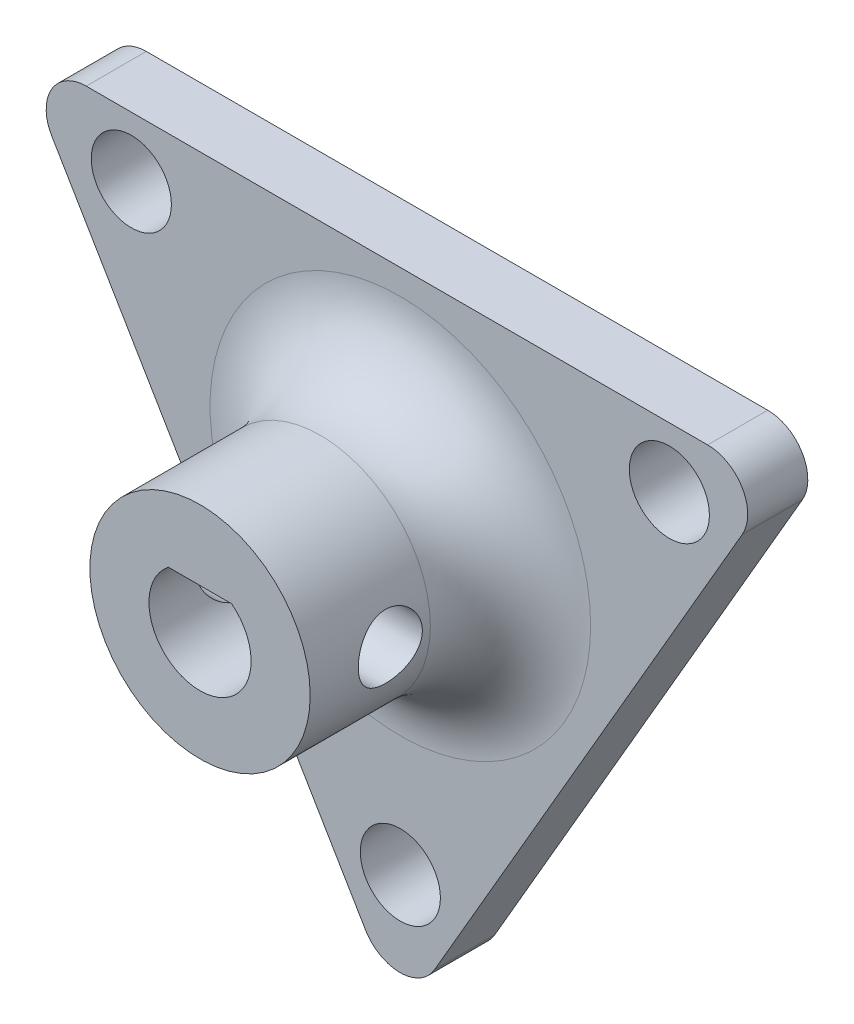
ISO-10303-21;
HEADER;
FILE_DESCRIPTION(('STEP AP214'),'2;1');
FILE_NAME('part.step','',(''),(''),'','','');
FILE_SCHEMA(('AUTOMOTIVE_DESIGN { 1 0 10303 214 1 1 1 1 }'));
ENDSEC;
DATA;
#1=APPLICATION_CONTEXT('core data for automotive mechanical design processes');
#2=APPLICATION_PROTOCOL_DEFINITION('international standard','automotive_design',2000,#1);
#3=PRODUCT_CONTEXT('',#1,'mechanical');
#4=PRODUCT('Part','Part','',(#3));
#5=PRODUCT_RELATED_PRODUCT_CATEGORY('part','',(#4));
#6=PRODUCT_DEFINITION_FORMATION('','',#4);
#7=PRODUCT_DEFINITION_CONTEXT('part definition',#1,'design');
#8=PRODUCT_DEFINITION('design','',#6,#7);
#9=PRODUCT_DEFINITION_SHAPE('','',#8);
#10=(LENGTH_UNIT() NAMED_UNIT(*) SI_UNIT(.MILLI.,.METRE.));
#11=(NAMED_UNIT(*) PLANE_ANGLE_UNIT() SI_UNIT($,.RADIAN.));
#12=(NAMED_UNIT(*) SI_UNIT($,.STERADIAN.) SOLID_ANGLE_UNIT());
#13=UNCERTAINTY_MEASURE_WITH_UNIT(LENGTH_MEASURE(1.E-05),#10,'distance_accuracy_value','');
#14=(GEOMETRIC_REPRESENTATION_CONTEXT(3) GLOBAL_UNCERTAINTY_ASSIGNED_CONTEXT((#13)) GLOBAL_UNIT_ASSIGNED_CONTEXT((#10,
#11,#12)) REPRESENTATION_CONTEXT('',''));
#15=CARTESIAN_POINT('',(0.,0.,0.));
#16=DIRECTION('',(0.,0.,1.));
#17=DIRECTION('',(1.,0.,0.));
#18=AXIS2_PLACEMENT_3D('',#15,#16,#17);
#19=CARTESIAN_POINT('',(0.,0.,3.));
#20=DIRECTION('',(0.,0.,1.));
#21=DIRECTION('',(1.,0.,0.));
#22=AXIS2_PLACEMENT_3D('',#19,#20,#21);
#23=PLANE('',#22);
#24=CARTESIAN_POINT('',(0.,3.88055185792684,3.));
#25=DIRECTION('',(0.,0.,1.));
#26=DIRECTION('',(1.,0.,0.));
#27=AXIS2_PLACEMENT_3D('',#24,#25,#26);
#28=CIRCLE('',#27,9.5);
#29=CARTESIAN_POINT('',(9.5,3.88055185792684,3.));
#30=VERTEX_POINT('',#29);
#31=EDGE_CURVE('E11',#30,#30,#28,.F.);
#32=ORIENTED_EDGE('',*,*,#31,.T.);
#33=EDGE_LOOP('',(#32));
#34=FACE_BOUND('',#33,.T.);
#35=CARTESIAN_POINT('',(13.4298049166789,11.6305518579268,3.));
#36=DIRECTION('',(0.,0.,1.));
#37=DIRECTION('',(1.,0.,0.));
#38=AXIS2_PLACEMENT_3D('',#35,#36,#37);
#39=CIRCLE('',#38,1.99999986367292);
#40=CARTESIAN_POINT('',(15.4298047803518,11.6305518579268,3.));
#41=VERTEX_POINT('',#40);
#42=EDGE_CURVE('E169',#41,#41,#39,.T.);
#43=ORIENTED_EDGE('',*,*,#42,.F.);
#44=EDGE_LOOP('',(#43));
#45=FACE_BOUND('',#44,.T.);
#46=DIRECTION('',(0.508933447570748,-0.860805870068132,0.));
#47=VECTOR('',#46,1.);
#48=CARTESIAN_POINT('',(1.2959652374831E-07,-17.8210655158097,3.));
#49=LINE('',#48,#47);
#50=CARTESIAN_POINT('',(-17.4020885722648,11.6126849627853,3.));
#51=VERTEX_POINT('',#50);
#52=CARTESIAN_POINT('',(-1.73853871700117,-14.8805151321866,3.));
#53=VERTEX_POINT('',#52);
#54=EDGE_CURVE('E185',#51,#53,#49,.T.);
#55=ORIENTED_EDGE('',*,*,#54,.T.);
#56=CARTESIAN_POINT('',(-0.0169269768649123,-13.8626482370451,3.));
#57=DIRECTION('',(0.,0.,1.));
#58=DIRECTION('',(1.,0.,0.));
#59=AXIS2_PLACEMENT_3D('',#56,#57,#58);
#60=CIRCLE('',#59,2.);
#61=CARTESIAN_POINT('',(1.71332690976511,-14.8657541575748,3.));
#62=VERTEX_POINT('',#61);
#63=EDGE_CURVE('E238',#53,#62,#60,.T.);
#64=ORIENTED_EDGE('',*,*,#63,.T.);
#65=DIRECTION('',(0.501552960264837,0.865126943315013,0.));
#66=VECTOR('',#65,1.);
#67=CARTESIAN_POINT('',(18.8136608125153,14.6305518579268,3.));
#68=LINE('',#67,#66);
#69=CARTESIAN_POINT('',(17.0726253771155,11.6274459373972,3.));
#70=VERTEX_POINT('',#69);
#71=EDGE_CURVE('E189',#62,#70,#68,.T.);
#72=ORIENTED_EDGE('',*,*,#71,.T.);
#73=CARTESIAN_POINT('',(15.3423714904855,12.6305518579268,3.));
#74=DIRECTION('',(0.,0.,1.));
#75=DIRECTION('',(1.,0.,0.));
#76=AXIS2_PLACEMENT_3D('',#73,#74,#75);
#77=CIRCLE('',#76,2.);
#78=CARTESIAN_POINT('',(15.3423714904855,14.6305518579268,3.));
#79=VERTEX_POINT('',#78);
#80=EDGE_CURVE('E75',#70,#79,#77,.T.);
#81=ORIENTED_EDGE('',*,*,#80,.T.);
#82=DIRECTION('',(-1.,0.,0.));
#83=VECTOR('',#82,1.);
#84=CARTESIAN_POINT('',(-19.1863391874847,14.6305518579268,3.));
#85=LINE('',#84,#83);
#86=CARTESIAN_POINT('',(-15.6804768321285,14.6305518579268,3.));
#87=VERTEX_POINT('',#86);
#88=EDGE_CURVE('E193',#79,#87,#85,.T.);
#89=ORIENTED_EDGE('',*,*,#88,.T.);
#90=CARTESIAN_POINT('',(-15.6804768321285,12.6305518579268,3.));
#91=DIRECTION('',(0.,0.,1.));
#92=DIRECTION('',(1.,0.,0.));
#93=AXIS2_PLACEMENT_3D('',#90,#91,#92);
#94=CIRCLE('',#93,2.);
#95=EDGE_CURVE('E233',#87,#51,#94,.T.);
#96=ORIENTED_EDGE('',*,*,#95,.T.);
#97=EDGE_LOOP('',(#55,#64,#72,#81,#89,#96));
#98=FACE_BOUND('',#97,.T.);
#99=CARTESIAN_POINT('',(-13.4298050858359,11.6305518579268,3.));
#100=DIRECTION('',(0.,0.,1.));
#101=DIRECTION('',(1.,0.,0.));
#102=AXIS2_PLACEMENT_3D('',#99,#100,#101);
#103=CIRCLE('',#102,2.00000003801693);
#104=CARTESIAN_POINT('',(-11.429805047819,11.6305518579268,3.));
#105=VERTEX_POINT('',#104);
#106=EDGE_CURVE('E177',#105,#105,#103,.T.);
#107=ORIENTED_EDGE('',*,*,#106,.F.);
#108=EDGE_LOOP('',(#107));
#109=FACE_BOUND('',#108,.T.);
#110=CARTESIAN_POINT('',(8.45785073921856E-08,-11.6305518579268,3.));
#111=DIRECTION('',(0.,0.,1.));
#112=DIRECTION('',(1.,0.,0.));
#113=AXIS2_PLACEMENT_3D('',#110,#111,#112);
#114=CIRCLE('',#113,1.99999985492947);
#115=CARTESIAN_POINT('',(1.99999993950797,-11.6305518579268,3.));
#116=VERTEX_POINT('',#115);
#117=EDGE_CURVE('E161',#116,#116,#114,.T.);
#118=ORIENTED_EDGE('',*,*,#117,.F.);
#119=EDGE_LOOP('',(#118));
#120=FACE_BOUND('',#119,.T.);
#121=ADVANCED_FACE('F45',(#34,#45,#98,#109,#120),#23,.T.);
#122=CARTESIAN_POINT('',(0.,0.,0.));
#123=DIRECTION('',(0.,0.,1.));
#124=DIRECTION('',(1.,0.,0.));
#125=AXIS2_PLACEMENT_3D('',#122,#123,#124);
#126=PLANE('',#125);
#127=DIRECTION('',(-1.,0.,0.));
#128=VECTOR('',#127,1.);
#129=CARTESIAN_POINT('',(-1.58192920195564,5.88055185792684,0.));
#130=LINE('',#129,#128);
#131=CARTESIAN_POINT('',(1.58192920195564,5.88055185792684,0.));
#132=VERTEX_POINT('',#131);
#133=CARTESIAN_POINT('',(-1.58192920195564,5.88055185792684,0.));
#134=VERTEX_POINT('',#133);
#135=EDGE_CURVE('E132',#132,#134,#130,.T.);
#136=ORIENTED_EDGE('',*,*,#135,.T.);
#137=CARTESIAN_POINT('',(0.,3.88055185792684,0.));
#138=DIRECTION('',(0.,0.,1.));
#139=DIRECTION('',(1.,0.,0.));
#140=AXIS2_PLACEMENT_3D('',#137,#138,#139);
#141=CIRCLE('',#140,2.55);
#142=EDGE_CURVE('E124',#134,#132,#141,.T.);
#143=ORIENTED_EDGE('',*,*,#142,.T.);
#144=EDGE_LOOP('',(#136,#143));
#145=FACE_BOUND('',#144,.T.);
#146=DIRECTION('',(0.501552960264837,0.865126943315013,0.));
#147=VECTOR('',#146,1.);
#148=CARTESIAN_POINT('',(18.8136608125153,14.6305518579268,0.));
#149=LINE('',#148,#147);
#150=CARTESIAN_POINT('',(1.71332690976511,-14.8657541575748,0.));
#151=VERTEX_POINT('',#150);
#152=CARTESIAN_POINT('',(17.0726253771155,11.6274459373972,0.));
#153=VERTEX_POINT('',#152);
#154=EDGE_CURVE('E200',#151,#153,#149,.T.);
#155=ORIENTED_EDGE('',*,*,#154,.F.);
#156=CARTESIAN_POINT('',(-0.0169269768649123,-13.8626482370451,0.));
#157=DIRECTION('',(0.,0.,1.));
#158=DIRECTION('',(1.,0.,0.));
#159=AXIS2_PLACEMENT_3D('',#156,#157,#158);
#160=CIRCLE('',#159,2.);
#161=CARTESIAN_POINT('',(-1.73853871700117,-14.8805151321866,0.));
#162=VERTEX_POINT('',#161);
#163=EDGE_CURVE('E223',#151,#162,#160,.F.);
#164=ORIENTED_EDGE('',*,*,#163,.T.);
#165=DIRECTION('',(0.508933447570748,-0.860805870068132,0.));
#166=VECTOR('',#165,1.);
#167=CARTESIAN_POINT('',(1.2959652374831E-07,-17.8210655158097,0.));
#168=LINE('',#167,#166);
#169=CARTESIAN_POINT('',(-17.4020885722648,11.6126849627853,0.));
#170=VERTEX_POINT('',#169);
#171=EDGE_CURVE('E181',#170,#162,#168,.T.);
#172=ORIENTED_EDGE('',*,*,#171,.F.);
#173=CARTESIAN_POINT('',(-15.6804768321285,12.6305518579268,0.));
#174=DIRECTION('',(0.,0.,1.));
#175=DIRECTION('',(1.,0.,0.));
#176=AXIS2_PLACEMENT_3D('',#173,#174,#175);
#177=CIRCLE('',#176,2.);
#178=CARTESIAN_POINT('',(-15.6804768321285,14.6305518579268,0.));
#179=VERTEX_POINT('',#178);
#180=EDGE_CURVE('E217',#170,#179,#177,.F.);
#181=ORIENTED_EDGE('',*,*,#180,.T.);
#182=DIRECTION('',(-1.,0.,0.));
#183=VECTOR('',#182,1.);
#184=CARTESIAN_POINT('',(-19.1863391874847,14.6305518579268,0.));
#185=LINE('',#184,#183);
#186=CARTESIAN_POINT('',(15.3423714904855,14.6305518579268,0.));
#187=VERTEX_POINT('',#186);
#188=EDGE_CURVE('E190',#187,#179,#185,.T.);
#189=ORIENTED_EDGE('',*,*,#188,.F.);
#190=CARTESIAN_POINT('',(15.3423714904855,12.6305518579268,0.));
#191=DIRECTION('',(0.,0.,1.));
#192=DIRECTION('',(1.,0.,0.));
#193=AXIS2_PLACEMENT_3D('',#190,#191,#192);
#194=CIRCLE('',#193,2.);
#195=EDGE_CURVE('E220',#187,#153,#194,.F.);
#196=ORIENTED_EDGE('',*,*,#195,.T.);
#197=EDGE_LOOP('',(#155,#164,#172,#181,#189,#196));
#198=FACE_BOUND('',#197,.T.);
#199=CARTESIAN_POINT('',(-13.4298050858359,11.6305518579268,0.));
#200=DIRECTION('',(0.,0.,1.));
#201=DIRECTION('',(1.,0.,0.));
#202=AXIS2_PLACEMENT_3D('',#199,#200,#201);
#203=CIRCLE('',#202,2.00000003801693);
#204=CARTESIAN_POINT('',(-11.429805047819,11.6305518579268,0.));
#205=VERTEX_POINT('',#204);
#206=EDGE_CURVE('E173',#205,#205,#203,.T.);
#207=ORIENTED_EDGE('',*,*,#206,.T.);
#208=EDGE_LOOP('',(#207));
#209=FACE_BOUND('',#208,.T.);
#210=CARTESIAN_POINT('',(13.4298049166789,11.6305518579268,0.));
#211=DIRECTION('',(0.,0.,1.));
#212=DIRECTION('',(1.,0.,0.));
#213=AXIS2_PLACEMENT_3D('',#210,#211,#212);
#214=CIRCLE('',#213,1.99999986367292);
#215=CARTESIAN_POINT('',(15.4298047803518,11.6305518579268,0.));
#216=VERTEX_POINT('',#215);
#217=EDGE_CURVE('E165',#216,#216,#214,.T.);
#218=ORIENTED_EDGE('',*,*,#217,.T.);
#219=EDGE_LOOP('',(#218));
#220=FACE_BOUND('',#219,.T.);
#221=CARTESIAN_POINT('',(8.45785073921856E-08,-11.6305518579268,0.));
#222=DIRECTION('',(0.,0.,1.));
#223=DIRECTION('',(1.,0.,0.));
#224=AXIS2_PLACEMENT_3D('',#221,#222,#223);
#225=CIRCLE('',#224,1.99999985492947);
#226=CARTESIAN_POINT('',(1.99999993950797,-11.6305518579268,0.));
#227=VERTEX_POINT('',#226);
#228=EDGE_CURVE('E160',#227,#227,#225,.T.);
#229=ORIENTED_EDGE('',*,*,#228,.T.);
#230=EDGE_LOOP('',(#229));
#231=FACE_BOUND('',#230,.T.);
#232=ADVANCED_FACE('F139',(#145,#198,#209,#220,#231),#126,.F.);
#233=CARTESIAN_POINT('',(1.2959652374831E-07,-17.8210655158097,3.));
#234=DIRECTION('',(0.860805870068132,0.508933447570747,0.));
#235=DIRECTION('',(-0.508933447570748,0.860805870068132,0.));
#236=AXIS2_PLACEMENT_3D('',#233,#234,#235);
#237=PLANE('',#236);
#238=ORIENTED_EDGE('',*,*,#171,.T.);
#239=DIRECTION('',(0.,0.,-1.));
#240=VECTOR('',#239,1.);
#241=CARTESIAN_POINT('',(-1.73853871700117,-14.8805151321866,3.));
#242=LINE('',#241,#240);
#243=EDGE_CURVE('E230',#162,#53,#242,.F.);
#244=ORIENTED_EDGE('',*,*,#243,.T.);
#245=ORIENTED_EDGE('',*,*,#54,.F.);
#246=DIRECTION('',(0.,0.,-1.));
#247=VECTOR('',#246,1.);
#248=CARTESIAN_POINT('',(-17.4020885722648,11.6126849627853,3.));
#249=LINE('',#248,#247);
#250=EDGE_CURVE('E226',#51,#170,#249,.T.);
#251=ORIENTED_EDGE('',*,*,#250,.T.);
#252=EDGE_LOOP('',(#238,#244,#245,#251));
#253=FACE_BOUND('',#252,.T.);
#254=ADVANCED_FACE('F296',(#253),#237,.F.);
#255=CARTESIAN_POINT('',(18.8136608125153,14.6305518579268,3.));
#256=DIRECTION('',(-0.865126943315013,0.501552960264837,0.));
#257=DIRECTION('',(-0.501552960264837,-0.865126943315013,0.));
#258=AXIS2_PLACEMENT_3D('',#255,#256,#257);
#259=PLANE('',#258);
#260=ORIENTED_EDGE('',*,*,#71,.F.);
#261=DIRECTION('',(0.,0.,-1.));
#262=VECTOR('',#261,1.);
#263=CARTESIAN_POINT('',(1.71332690976512,-14.8657541575748,3.));
#264=LINE('',#263,#262);
#265=EDGE_CURVE('E213',#62,#151,#264,.T.);
#266=ORIENTED_EDGE('',*,*,#265,.T.);
#267=ORIENTED_EDGE('',*,*,#154,.T.);
#268=DIRECTION('',(0.,0.,-1.));
#269=VECTOR('',#268,1.);
#270=CARTESIAN_POINT('',(17.0726253771155,11.6274459373972,3.));
#271=LINE('',#270,#269);
#272=EDGE_CURVE('E210',#153,#70,#271,.F.);
#273=ORIENTED_EDGE('',*,*,#272,.T.);
#274=EDGE_LOOP('',(#260,#266,#267,#273));
#275=FACE_BOUND('',#274,.T.);
#276=ADVANCED_FACE('F299',(#275),#259,.F.);
#277=CARTESIAN_POINT('',(-19.1863391874847,14.6305518579268,3.));
#278=DIRECTION('',(0.,-1.,0.));
#279=DIRECTION('',(0.,0.,-1.));
#280=AXIS2_PLACEMENT_3D('',#277,#278,#279);
#281=PLANE('',#280);
#282=ORIENTED_EDGE('',*,*,#88,.F.);
#283=DIRECTION('',(0.,0.,-1.));
#284=VECTOR('',#283,1.);
#285=CARTESIAN_POINT('',(15.3423714904855,14.6305518579268,3.));
#286=LINE('',#285,#284);
#287=EDGE_CURVE('E243',#79,#187,#286,.T.);
#288=ORIENTED_EDGE('',*,*,#287,.T.);
#289=ORIENTED_EDGE('',*,*,#188,.T.);
#290=DIRECTION('',(0.,0.,-1.));
#291=VECTOR('',#290,1.);
#292=CARTESIAN_POINT('',(-15.6804768321285,14.6305518579268,3.));
#293=LINE('',#292,#291);
#294=EDGE_CURVE('E68',#179,#87,#293,.F.);
#295=ORIENTED_EDGE('',*,*,#294,.T.);
#296=EDGE_LOOP('',(#282,#288,#289,#295));
#297=FACE_BOUND('',#296,.T.);
#298=ADVANCED_FACE('F289',(#297),#281,.F.);
#299=CARTESIAN_POINT('',(-13.4298050858359,11.6305518579268,3.));
#300=DIRECTION('',(0.,0.,-1.));
#301=DIRECTION('',(-1.,0.,0.));
#302=AXIS2_PLACEMENT_3D('',#299,#300,#301);
#303=CYLINDRICAL_SURFACE('',#302,2.00000003801693);
#304=ORIENTED_EDGE('',*,*,#106,.T.);
#305=EDGE_LOOP('',(#304));
#306=FACE_BOUND('',#305,.T.);
#307=ORIENTED_EDGE('',*,*,#206,.F.);
#308=EDGE_LOOP('',(#307));
#309=FACE_BOUND('',#308,.T.);
#310=ADVANCED_FACE('F285',(#306,#309),#303,.F.);
#311=CARTESIAN_POINT('',(13.4298049166789,11.6305518579268,3.));
#312=DIRECTION('',(0.,0.,-1.));
#313=DIRECTION('',(-1.,0.,0.));
#314=AXIS2_PLACEMENT_3D('',#311,#312,#313);
#315=CYLINDRICAL_SURFACE('',#314,1.99999986367292);
#316=ORIENTED_EDGE('',*,*,#42,.T.);
#317=EDGE_LOOP('',(#316));
#318=FACE_BOUND('',#317,.T.);
#319=ORIENTED_EDGE('',*,*,#217,.F.);
#320=EDGE_LOOP('',(#319));
#321=FACE_BOUND('',#320,.T.);
#322=ADVANCED_FACE('F281',(#318,#321),#315,.F.);
#323=CARTESIAN_POINT('',(8.45785073921856E-08,-11.6305518579268,3.));
#324=DIRECTION('',(0.,0.,-1.));
#325=DIRECTION('',(-1.,0.,0.));
#326=AXIS2_PLACEMENT_3D('',#323,#324,#325);
#327=CYLINDRICAL_SURFACE('',#326,1.99999985492947);
#328=ORIENTED_EDGE('',*,*,#117,.T.);
#329=EDGE_LOOP('',(#328));
#330=FACE_BOUND('',#329,.T.);
#331=ORIENTED_EDGE('',*,*,#228,.F.);
#332=EDGE_LOOP('',(#331));
#333=FACE_BOUND('',#332,.T.);
#334=ADVANCED_FACE('F276',(#330,#333),#327,.F.);
#335=CARTESIAN_POINT('',(0.,3.88055185792684,13.));
#336=DIRECTION('',(0.,0.,-1.));
#337=DIRECTION('',(-1.,0.,0.));
#338=AXIS2_PLACEMENT_3D('',#335,#336,#337);
#339=CYLINDRICAL_SURFACE('',#338,5.5);
#340=CARTESIAN_POINT('',(-5.5,3.88055185792684,10.6));
#341=CARTESIAN_POINT('',(-5.4999990518237,3.79265586523784,10.5999986170172));
#342=CARTESIAN_POINT('',(-5.49787267544624,3.70474577234315,10.5927330510063));
#343=CARTESIAN_POINT('',(-5.48959750284409,3.53147787241869,10.5639267207549));
#344=CARTESIAN_POINT('',(-5.48344730058792,3.44612096844715,10.5423809666037));
#345=CARTESIAN_POINT('',(-5.46779977682029,3.28048410165374,10.4857888707706));
#346=CARTESIAN_POINT('',(-5.4583072215572,3.20019710034166,10.4507617471476));
#347=CARTESIAN_POINT('',(-5.43696627416899,3.04663601362485,10.3682779022879));
#348=CARTESIAN_POINT('',(-5.425117611205,2.97336273589621,10.3208197518828));
#349=CARTESIAN_POINT('',(-5.39997279501187,2.83391885520458,10.2134619236042));
#350=CARTESIAN_POINT('',(-5.38664833166273,2.76796574197321,10.1532863959955));
#351=CARTESIAN_POINT('',(-5.36022610122049,2.64693041122393,10.0227903658559));
#352=CARTESIAN_POINT('',(-5.34712836986439,2.59184989344163,9.95246828006211));
#353=CARTESIAN_POINT('',(-5.32234596280303,2.49300291478489,9.80186476880044));
#354=CARTESIAN_POINT('',(-5.31069662584938,2.44949756539669,9.72140560757975));
#355=CARTESIAN_POINT('',(-5.29055119125395,2.37672204213962,9.55391994806736));
#356=CARTESIAN_POINT('',(-5.28205438731091,2.34744867924474,9.46689492607133));
#357=CARTESIAN_POINT('',(-5.26947030749288,2.30474418109732,9.29118106785702));
#358=CARTESIAN_POINT('',(-5.26527217972364,2.29091390574007,9.2025973825931));
#359=CARTESIAN_POINT('',(-5.26143058940414,2.27824231545189,9.02427525355214));
#360=CARTESIAN_POINT('',(-5.26178609680484,2.27939761073045,8.9345370755136));
#361=CARTESIAN_POINT('',(-5.26691308588751,2.29634991373368,8.75966110920231));
#362=CARTESIAN_POINT('',(-5.27153524590158,2.31165185352926,8.67447023506899));
#363=CARTESIAN_POINT('',(-5.28443387237583,2.35566518738724,8.50792105022176));
#364=CARTESIAN_POINT('',(-5.29271068004168,2.38437783351614,8.42656309814265));
#365=CARTESIAN_POINT('',(-5.31210856656912,2.45477297728128,8.26875589991645));
#366=CARTESIAN_POINT('',(-5.32326531844177,2.49661967813144,8.19238447376992));
#367=CARTESIAN_POINT('',(-5.34714829219519,2.59198083347845,8.04757955359752));
#368=CARTESIAN_POINT('',(-5.35987487439257,2.64549796881405,7.97914788897269));
#369=CARTESIAN_POINT('',(-5.38607369451695,2.76516020360842,7.84935099700993));
#370=CARTESIAN_POINT('',(-5.39955562083306,2.83171758400351,7.78836719415668));
#371=CARTESIAN_POINT('',(-5.42530316429731,2.97428197046411,7.67834093198708));
#372=CARTESIAN_POINT('',(-5.43756871370187,3.05028950230546,7.62929913753488));
#373=CARTESIAN_POINT('',(-5.45960243201934,3.21026060009364,7.54433586299851));
#374=CARTESIAN_POINT('',(-5.46935523580978,3.29426900418505,7.50849455553789));
#375=CARTESIAN_POINT('',(-5.48515388088791,3.46746990327772,7.45155972414816));
#376=CARTESIAN_POINT('',(-5.49120069206717,3.55666103521705,7.43046234139859));
#377=CARTESIAN_POINT('',(-5.49875452656796,3.7344494834954,7.40423895002686));
#378=CARTESIAN_POINT('',(-5.5004085556206,3.82296435690596,7.3985955600457));
#379=CARTESIAN_POINT('',(-5.49941929543004,3.99967997928469,7.40199625209312));
#380=CARTESIAN_POINT('',(-5.49677654247024,4.08788076607724,7.41103850119998));
#381=CARTESIAN_POINT('',(-5.48758657715466,4.25954184604505,7.44313355477378));
#382=CARTESIAN_POINT('',(-5.48112258446653,4.34306280864629,7.46588793289285));
#383=CARTESIAN_POINT('',(-5.46503343330605,4.5050866454419,7.52440584164335));
#384=CARTESIAN_POINT('',(-5.45540790373483,4.58358892925459,7.56017089951176));
#385=CARTESIAN_POINT('',(-5.43373196590243,4.73528112619763,7.64458891461328));
#386=CARTESIAN_POINT('',(-5.42163247833979,4.80831445597293,7.69351030494628));
#387=CARTESIAN_POINT('',(-5.39640103270706,4.94531302598663,7.80252303330607));
#388=CARTESIAN_POINT('',(-5.38326883154519,5.0092761211783,7.86261700583005));
#389=CARTESIAN_POINT('',(-5.35689415850173,5.12856980558689,7.99469655588623));
#390=CARTESIAN_POINT('',(-5.3436631170658,5.18353296774154,8.06701696764486));
#391=CARTESIAN_POINT('',(-5.31906767995036,5.2805638949979,8.22014093572333));
#392=CARTESIAN_POINT('',(-5.30770322446059,5.32263207332587,8.3009442200938));
#393=CARTESIAN_POINT('',(-5.2882600680365,5.39237784460313,8.46843057409818));
#394=CARTESIAN_POINT('',(-5.28016467097066,5.42012876767886,8.55508105887871));
#395=CARTESIAN_POINT('',(-5.26820528008861,5.46057289823852,8.73210154969121));
#396=CARTESIAN_POINT('',(-5.26433994487076,5.47327087929123,8.8224703671592));
#397=CARTESIAN_POINT('',(-5.26140494243124,5.48293765416079,9.00056159962261));
#398=CARTESIAN_POINT('',(-5.26215342138962,5.48050287468896,9.08824908344183));
#399=CARTESIAN_POINT('',(-5.26792771290673,5.46138554663608,9.26190610715084));
#400=CARTESIAN_POINT('',(-5.27295337278351,5.4447035066375,9.34787570825156));
#401=CARTESIAN_POINT('',(-5.28659750790534,5.39793966899867,9.51474552954434));
#402=CARTESIAN_POINT('',(-5.29517597227329,5.36800684783827,9.59569100908229));
#403=CARTESIAN_POINT('',(-5.31495395363785,5.29570654878517,9.75147529182891));
#404=CARTESIAN_POINT('',(-5.32615394837703,5.2533368040538,9.82631297860871));
#405=CARTESIAN_POINT('',(-5.35039522359373,5.15565289904215,9.97054775712387));
#406=CARTESIAN_POINT('',(-5.36348668211837,5.09994273252979,10.039668226737));
#407=CARTESIAN_POINT('',(-5.38978242996599,4.97788353896104,10.1677729619066));
#408=CARTESIAN_POINT('',(-5.40298674716289,4.91153180728134,10.2267546427072));
#409=CARTESIAN_POINT('',(-5.4284463110724,4.76792048074744,10.3344841877481));
#410=CARTESIAN_POINT('',(-5.44066644445546,4.69041535090587,10.3829138518827));
#411=CARTESIAN_POINT('',(-5.46237080790901,4.52800737491667,10.4659844109284));
#412=CARTESIAN_POINT('',(-5.47185645606653,4.44310839302835,10.5006324564548));
#413=CARTESIAN_POINT('',(-5.48607998496091,4.27911095346568,10.5516424700274));
#414=CARTESIAN_POINT('',(-5.49125834417518,4.20058353958858,10.569729481646));
#415=CARTESIAN_POINT('',(-5.49821853945562,4.04155845460591,10.5939080094983));
#416=CARTESIAN_POINT('',(-5.50000086849156,3.96106107118082,10.6000012667569));
#417=CARTESIAN_POINT('',(-5.5,3.88055185792684,10.6));
#418=B_SPLINE_CURVE_WITH_KNOTS('',3,(#340,#341,#342,#343,#344,#345,#346,#347,#348,#349,#350,
#351,#352,#353,#354,#355,#356,#357,#358,#359,#360,#361,#362,#363,#364,#365,#366,#367,#368,#369,
#370,#371,#372,#373,#374,#375,#376,#377,#378,#379,#380,#381,#382,#383,#384,#385,#386,#387,#388,
#389,#390,#391,#392,#393,#394,#395,#396,#397,#398,#399,#400,#401,#402,#403,#404,#405,#406,#407,
#408,#409,#410,#411,#412,#413,#414,#415,#416,#417),.UNSPECIFIED.,.T.,.F.,(4,2,2,2,2,2,2,2,2,2,2,
2,2,2,2,2,2,2,2,2,2,2,2,2,2,2,2,2,2,2,2,2,2,2,2,2,2,2,4),(0.,0.26339238749598,0.526876860467933,
0.78998711205177,1.05312762614056,1.32270257552884,1.5923196348149,1.86758333104342,
2.14278531922193,2.41069679846212,2.67854767620972,2.93736597145256,3.19620843563201,
3.4584253306978,3.72070252369837,3.99324547725547,4.26580360101093,4.53999081480504,
4.81410624066673,5.07892543795108,5.34371158556329,5.60293323026853,5.86218531309874,
6.12719160340689,6.39226046169031,6.66634126342792,6.94041328118916,7.21306726183037,
7.4856347556579,7.74752953929421,8.00941497449961,8.26842802859663,8.52748832152793,
8.79548243292643,9.06354476503305,9.33882258630507,9.61395739233519,9.85524931170683,
10.09650620233),.UNSPECIFIED.);
#419=CARTESIAN_POINT('',(-5.5,3.88055185792684,10.6));
#420=VERTEX_POINT('',#419);
#421=EDGE_CURVE('E142',#420,#420,#418,.T.);
#422=ORIENTED_EDGE('',*,*,#421,.T.);
#423=EDGE_LOOP('',(#422));
#424=FACE_BOUND('',#423,.T.);
#425=CARTESIAN_POINT('',(5.5,3.88055185792684,7.4));
#426=CARTESIAN_POINT('',(5.4999990518237,3.79265586523784,7.40000138298277));
#427=CARTESIAN_POINT('',(5.49787267544624,3.70474577234315,7.40726694899374));
#428=CARTESIAN_POINT('',(5.48959750284409,3.53147787241869,7.4360732792451));
#429=CARTESIAN_POINT('',(5.48344730058792,3.44612096844715,7.45761903339626));
#430=CARTESIAN_POINT('',(5.46779977682029,3.28048410165374,7.51421112922942));
#431=CARTESIAN_POINT('',(5.4583072215572,3.20019710034166,7.54923825285241));
#432=CARTESIAN_POINT('',(5.43696627416899,3.04663601362485,7.63172209771212));
#433=CARTESIAN_POINT('',(5.425117611205,2.97336273589621,7.67918024811716));
#434=CARTESIAN_POINT('',(5.39997279501187,2.83391885520458,7.78653807639583));
#435=CARTESIAN_POINT('',(5.38664833166273,2.76796574197321,7.84671360400452));
#436=CARTESIAN_POINT('',(5.36022610122049,2.64693041122393,7.97720963414408));
#437=CARTESIAN_POINT('',(5.34712836986439,2.59184989344163,8.04753171993789));
#438=CARTESIAN_POINT('',(5.32234596280303,2.49300291478489,8.19813523119956));
#439=CARTESIAN_POINT('',(5.31069662584938,2.44949756539669,8.27859439242025));
#440=CARTESIAN_POINT('',(5.29055119125395,2.37672204213963,8.44608005193264));
#441=CARTESIAN_POINT('',(5.28205438731091,2.34744867924474,8.53310507392868));
#442=CARTESIAN_POINT('',(5.26947030749288,2.30474418109732,8.70881893214299));
#443=CARTESIAN_POINT('',(5.26527217972364,2.29091390574007,8.7974026174069));
#444=CARTESIAN_POINT('',(5.26143058940414,2.27824231545189,8.97572474644786));
#445=CARTESIAN_POINT('',(5.26178609680484,2.27939761073045,9.0654629244864));
#446=CARTESIAN_POINT('',(5.26691308588751,2.29634991373368,9.24033889079769));
#447=CARTESIAN_POINT('',(5.27153524590158,2.31165185352926,9.32552976493101));
#448=CARTESIAN_POINT('',(5.28443387237583,2.35566518738724,9.49207894977825));
#449=CARTESIAN_POINT('',(5.29271068004168,2.38437783351614,9.57343690185735));
#450=CARTESIAN_POINT('',(5.31210856656912,2.45477297728128,9.73124410008355));
#451=CARTESIAN_POINT('',(5.32326531844177,2.49661967813144,9.80761552623008));
#452=CARTESIAN_POINT('',(5.34714829219519,2.59198083347845,9.95242044640249));
#453=CARTESIAN_POINT('',(5.35987487439257,2.64549796881405,10.0208521110273));
#454=CARTESIAN_POINT('',(5.38607369451695,2.76516020360842,10.1506490029901));
#455=CARTESIAN_POINT('',(5.39955562083306,2.83171758400351,10.2116328058433));
#456=CARTESIAN_POINT('',(5.42530316429731,2.97428197046411,10.3216590680129));
#457=CARTESIAN_POINT('',(5.43756871370187,3.05028950230546,10.3707008624651));
#458=CARTESIAN_POINT('',(5.45960243201934,3.21026060009363,10.4556641370015));
#459=CARTESIAN_POINT('',(5.46935523580978,3.29426900418505,10.4915054444621));
#460=CARTESIAN_POINT('',(5.48515388088791,3.46746990327772,10.5484402758518));
#461=CARTESIAN_POINT('',(5.49120069206717,3.55666103521705,10.5695376586014));
#462=CARTESIAN_POINT('',(5.49875452656796,3.7344494834954,10.5957610499731));
#463=CARTESIAN_POINT('',(5.5004085556206,3.82296435690595,10.6014044399543));
#464=CARTESIAN_POINT('',(5.49941929543004,3.99967997928469,10.5980037479069));
#465=CARTESIAN_POINT('',(5.49677654247024,4.08788076607724,10.5889614988));
#466=CARTESIAN_POINT('',(5.48758657715466,4.25954184604505,10.5568664452262));
#467=CARTESIAN_POINT('',(5.48112258446653,4.34306280864629,10.5341120671072));
#468=CARTESIAN_POINT('',(5.46503343330605,4.5050866454419,10.4755941583567));
#469=CARTESIAN_POINT('',(5.45540790373483,4.58358892925458,10.4398291004882));
#470=CARTESIAN_POINT('',(5.43373196590243,4.73528112619762,10.3554110853867));
#471=CARTESIAN_POINT('',(5.42163247833979,4.80831445597293,10.3064896950537));
#472=CARTESIAN_POINT('',(5.39640103270706,4.94531302598663,10.1974769666939));
#473=CARTESIAN_POINT('',(5.38326883154519,5.0092761211783,10.13738299417));
#474=CARTESIAN_POINT('',(5.35689415850173,5.12856980558688,10.0053034441138));
#475=CARTESIAN_POINT('',(5.3436631170658,5.18353296774154,9.93298303235515));
#476=CARTESIAN_POINT('',(5.31906767995036,5.28056389499789,9.77985906427668));
#477=CARTESIAN_POINT('',(5.30770322446059,5.32263207332587,9.6990557799062));
#478=CARTESIAN_POINT('',(5.2882600680365,5.39237784460313,9.53156942590182));
#479=CARTESIAN_POINT('',(5.28016467097066,5.42012876767886,9.44491894112129));
#480=CARTESIAN_POINT('',(5.26820528008861,5.46057289823852,9.26789845030879));
#481=CARTESIAN_POINT('',(5.26433994487076,5.47327087929123,9.17752963284081));
#482=CARTESIAN_POINT('',(5.26140494243124,5.48293765416079,8.99943840037739));
#483=CARTESIAN_POINT('',(5.26215342138962,5.48050287468896,8.91175091655818));
#484=CARTESIAN_POINT('',(5.26792771290673,5.46138554663608,8.73809389284916));
#485=CARTESIAN_POINT('',(5.27295337278351,5.4447035066375,8.65212429174845));
#486=CARTESIAN_POINT('',(5.28659750790534,5.39793966899867,8.48525447045566));
#487=CARTESIAN_POINT('',(5.29517597227329,5.36800684783827,8.40430899091771));
#488=CARTESIAN_POINT('',(5.31495395363785,5.29570654878517,8.24852470817109));
#489=CARTESIAN_POINT('',(5.32615394837703,5.2533368040538,8.17368702139129));
#490=CARTESIAN_POINT('',(5.35039522359373,5.15565289904215,8.02945224287613));
#491=CARTESIAN_POINT('',(5.36348668211837,5.09994273252979,7.96033177326303));
#492=CARTESIAN_POINT('',(5.38978242996598,4.97788353896104,7.8322270380934));
#493=CARTESIAN_POINT('',(5.40298674716289,4.91153180728134,7.77324535729285));
#494=CARTESIAN_POINT('',(5.4284463110724,4.76792048074744,7.66551581225186));
#495=CARTESIAN_POINT('',(5.44066644445546,4.69041535090587,7.61708614811732));
#496=CARTESIAN_POINT('',(5.46237080790901,4.52800737491668,7.53401558907165));
#497=CARTESIAN_POINT('',(5.47185645606653,4.44310839302835,7.4993675435452));
#498=CARTESIAN_POINT('',(5.48607998496091,4.27911095346568,7.4483575299726));
#499=CARTESIAN_POINT('',(5.49125834417518,4.20058353958858,7.43027051835405));
#500=CARTESIAN_POINT('',(5.49821853945562,4.04155845460591,7.4060919905017));
#501=CARTESIAN_POINT('',(5.50000086849156,3.96106107118082,7.3999987332431));
#502=CARTESIAN_POINT('',(5.5,3.88055185792684,7.4));
#503=B_SPLINE_CURVE_WITH_KNOTS('',3,(#425,#426,#427,#428,#429,#430,#431,#432,#433,#434,#435,
#436,#437,#438,#439,#440,#441,#442,#443,#444,#445,#446,#447,#448,#449,#450,#451,#452,#453,#454,
#455,#456,#457,#458,#459,#460,#461,#462,#463,#464,#465,#466,#467,#468,#469,#470,#471,#472,#473,
#474,#475,#476,#477,#478,#479,#480,#481,#482,#483,#484,#485,#486,#487,#488,#489,#490,#491,#492,
#493,#494,#495,#496,#497,#498,#499,#500,#501,#502),.UNSPECIFIED.,.T.,.F.,(4,2,2,2,2,2,2,2,2,2,2,
2,2,2,2,2,2,2,2,2,2,2,2,2,2,2,2,2,2,2,2,2,2,2,2,2,2,2,4),(0.,0.26339238749598,0.526876860467933,
0.789987112051771,1.05312762614056,1.32270257552884,1.5923196348149,1.86758333104342,
2.14278531922193,2.41069679846212,2.67854767620972,2.93736597145256,3.19620843563201,
3.45842533069781,3.72070252369837,3.99324547725547,4.26580360101093,4.53999081480504,
4.81410624066673,5.07892543795108,5.34371158556329,5.60293323026853,5.86218531309874,
6.12719160340689,6.39226046169031,6.66634126342792,6.94041328118916,7.21306726183037,
7.4856347556579,7.74752953929421,8.00941497449961,8.26842802859663,8.52748832152793,
8.79548243292643,9.06354476503305,9.33882258630507,9.61395739233519,9.85524931170684,
10.09650620233),.UNSPECIFIED.);
#504=CARTESIAN_POINT('',(5.5,3.88055185792684,7.4));
#505=VERTEX_POINT('',#504);
#506=EDGE_CURVE('E146',#505,#505,#503,.T.);
#507=ORIENTED_EDGE('',*,*,#506,.T.);
#508=EDGE_LOOP('',(#507));
#509=FACE_BOUND('',#508,.T.);
#510=CARTESIAN_POINT('',(0.,3.88055185792684,7.));
#511=DIRECTION('',(0.,0.,1.));
#512=DIRECTION('',(1.,0.,0.));
#513=AXIS2_PLACEMENT_3D('',#510,#511,#512);
#514=CIRCLE('',#513,5.5);
#515=CARTESIAN_POINT('',(5.5,3.88055185792684,7.));
#516=VERTEX_POINT('',#515);
#517=EDGE_CURVE('E60',#516,#516,#514,.T.);
#518=ORIENTED_EDGE('',*,*,#517,.T.);
#519=EDGE_LOOP('',(#518));
#520=FACE_BOUND('',#519,.T.);
#521=CARTESIAN_POINT('',(0.,3.88055185792684,13.));
#522=DIRECTION('',(0.,0.,1.));
#523=DIRECTION('',(1.,0.,0.));
#524=AXIS2_PLACEMENT_3D('',#521,#522,#523);
#525=CIRCLE('',#524,5.5);
#526=CARTESIAN_POINT('',(5.5,3.88055185792684,13.));
#527=VERTEX_POINT('',#526);
#528=EDGE_CURVE('E156',#527,#527,#525,.T.);
#529=ORIENTED_EDGE('',*,*,#528,.F.);
#530=EDGE_LOOP('',(#529));
#531=FACE_BOUND('',#530,.T.);
#532=ADVANCED_FACE('F271',(#424,#509,#520,#531),#339,.T.);
#533=CARTESIAN_POINT('',(0.,3.88055185792684,13.));
#534=DIRECTION('',(0.,0.,1.));
#535=DIRECTION('',(1.,0.,0.));
#536=AXIS2_PLACEMENT_3D('',#533,#534,#535);
#537=PLANE('',#536);
#538=CARTESIAN_POINT('',(0.,3.88055185792684,13.));
#539=DIRECTION('',(0.,0.,1.));
#540=DIRECTION('',(1.,0.,0.));
#541=AXIS2_PLACEMENT_3D('',#538,#539,#540);
#542=CIRCLE('',#541,2.55);
#543=CARTESIAN_POINT('',(-1.58192920195564,5.88055185792684,13.));
#544=VERTEX_POINT('',#543);
#545=CARTESIAN_POINT('',(1.58192920195564,5.88055185792684,13.));
#546=VERTEX_POINT('',#545);
#547=EDGE_CURVE('E127',#544,#546,#542,.T.);
#548=ORIENTED_EDGE('',*,*,#547,.F.);
#549=DIRECTION('',(1.,0.,0.));
#550=VECTOR('',#549,1.);
#551=CARTESIAN_POINT('',(-1.58192920195564,5.88055185792684,13.));
#552=LINE('',#551,#550);
#553=EDGE_CURVE('E196',#546,#544,#552,.F.);
#554=ORIENTED_EDGE('',*,*,#553,.F.);
#555=EDGE_LOOP('',(#548,#554));
#556=FACE_BOUND('',#555,.T.);
#557=ORIENTED_EDGE('',*,*,#528,.T.);
#558=EDGE_LOOP('',(#557));
#559=FACE_BOUND('',#558,.T.);
#560=ADVANCED_FACE('F275',(#556,#559),#537,.T.);
#561=CARTESIAN_POINT('',(0.,3.88055185792684,0.));
#562=DIRECTION('',(0.,0.,1.));
#563=DIRECTION('',(1.,0.,0.));
#564=AXIS2_PLACEMENT_3D('',#561,#562,#563);
#565=CYLINDRICAL_SURFACE('',#564,2.55);
#566=CARTESIAN_POINT('',(-2.55,3.88055185792684,7.4));
#567=CARTESIAN_POINT('',(-2.54999386100954,3.79931531579889,7.40000669066773));
#568=CARTESIAN_POINT('',(-2.546077231603,3.71798182499397,7.40622918011606));
#569=CARTESIAN_POINT('',(-2.53077989819863,3.55781601810989,7.43078515781543));
#570=CARTESIAN_POINT('',(-2.51938539209013,3.47898861019241,7.4491410414395));
#571=CARTESIAN_POINT('',(-2.49027801132901,3.32646207618089,7.49688983097959));
#572=CARTESIAN_POINT('',(-2.47259641183149,3.25273968599758,7.52622814224966));
#573=CARTESIAN_POINT('',(-2.43238404224398,3.11152232668526,7.59473846878293));
#574=CARTESIAN_POINT('',(-2.40985374752504,3.04402674799939,7.63390952009683));
#575=CARTESIAN_POINT('',(-2.35966710217655,2.91105906719967,7.7244360437686));
#576=CARTESIAN_POINT('',(-2.33174459197155,2.84618309040133,7.77651662289197));
#577=CARTESIAN_POINT('',(-2.27439004463659,2.72550889175946,7.88971468990176));
#578=CARTESIAN_POINT('',(-2.24495600580948,2.66972313814906,7.95084437405096));
#579=CARTESIAN_POINT('',(-2.18307752682562,2.56104842172556,8.09018940055527));
#580=CARTESIAN_POINT('',(-2.15077169863223,2.50959828420594,8.16959803631394));
#581=CARTESIAN_POINT('',(-2.09160878452229,2.42092107513194,8.33782288311347));
#582=CARTESIAN_POINT('',(-2.06474250683504,2.38366991445017,8.42662283141044));
#583=CARTESIAN_POINT('',(-2.02686579060879,2.33295883528831,8.58757091107233));
#584=CARTESIAN_POINT('',(-2.01354708147823,2.31582686010006,8.65801514477928));
#585=CARTESIAN_POINT('',(-1.99420912464458,2.29124924523945,8.80151295419285));
#586=CARTESIAN_POINT('',(-1.988179441887,2.28378975720776,8.87456264517472));
#587=CARTESIAN_POINT('',(-1.9843286293893,2.27900508702827,9.02141622593716));
#588=CARTESIAN_POINT('',(-1.98652962249362,2.28170721792528,9.09522161583897));
#589=CARTESIAN_POINT('',(-1.99883488854414,2.29712220066319,9.24112687878509));
#590=CARTESIAN_POINT('',(-2.00894552933589,2.30984311841677,9.31322532941357));
#591=CARTESIAN_POINT('',(-2.03528600386737,2.34414102812449,9.45215731191646));
#592=CARTESIAN_POINT('',(-2.05136362353672,2.36549882115563,9.51907554428186));
#593=CARTESIAN_POINT('',(-2.0878709382275,2.41621951314987,9.64851289042027));
#594=CARTESIAN_POINT('',(-2.10830216756769,2.44558523532686,9.71103044292526));
#595=CARTESIAN_POINT('',(-2.15584920195694,2.51782898515961,9.84238505231924));
#596=CARTESIAN_POINT('',(-2.18349966490613,2.56220922789745,9.91020191920421));
#597=CARTESIAN_POINT('',(-2.23986575951379,2.66042283284853,10.0381721907069));
#598=CARTESIAN_POINT('',(-2.2685824676014,2.71426596493142,10.0983175631224));
#599=CARTESIAN_POINT('',(-2.32949718059487,2.84053337667933,10.2195268674554));
#600=CARTESIAN_POINT('',(-2.36147151782637,2.91455945795594,10.2790537541484));
#601=CARTESIAN_POINT('',(-2.42037036533975,3.07341475895242,10.3847802855871));
#602=CARTESIAN_POINT('',(-2.44729677202056,3.15823990150704,10.4309849387332));
#603=CARTESIAN_POINT('',(-2.49182990479915,3.33201676430128,10.5058458601204));
#604=CARTESIAN_POINT('',(-2.50985482038199,3.42051174006557,10.5353021743594));
#605=CARTESIAN_POINT('',(-2.53646608968931,3.6025910339274,10.578434278876));
#606=CARTESIAN_POINT('',(-2.54506602086911,3.69616782660099,10.5921327709928));
#607=CARTESIAN_POINT('',(-2.5512442332126,3.87048122513743,10.6019838735055));
#608=CARTESIAN_POINT('',(-2.55027898792779,3.95104427535761,10.600454936579));
#609=CARTESIAN_POINT('',(-2.54085871869709,4.11058706552673,10.585401800224));
#610=CARTESIAN_POINT('',(-2.532404247579,4.18956692190133,10.5718784861774));
#611=CARTESIAN_POINT('',(-2.5092909508591,4.34050920220223,10.5343557457088));
#612=CARTESIAN_POINT('',(-2.49489866742643,4.41262640801041,10.5108051322146));
#613=CARTESIAN_POINT('',(-2.46110795878822,4.55180532751069,10.4543258393745));
#614=CARTESIAN_POINT('',(-2.4417087075367,4.61886620465219,10.4213956124936));
#615=CARTESIAN_POINT('',(-2.39712984603736,4.75335123691437,10.3434494858017));
#616=CARTESIAN_POINT('',(-2.37156520351372,4.82013426654811,10.2975514530034));
#617=CARTESIAN_POINT('',(-2.31797633154248,4.94551433827699,10.1968021322958));
#618=CARTESIAN_POINT('',(-2.28994940666147,5.00410222277581,10.1419409746486));
#619=CARTESIAN_POINT('',(-2.22942328693423,5.12033570378995,10.0155552732274));
#620=CARTESIAN_POINT('',(-2.1968704422334,5.17658574581198,9.94276698461711));
#621=CARTESIAN_POINT('',(-2.13491998634426,5.27628164475195,9.78766889549146));
#622=CARTESIAN_POINT('',(-2.10552032634318,5.31973584833079,9.70536535074734));
#623=CARTESIAN_POINT('',(-2.05944463960951,5.38469060078326,9.55051494923917));
#624=CARTESIAN_POINT('',(-2.04139381790496,5.40887932580771,9.47951104604882));
#625=CARTESIAN_POINT('',(-2.01212723844525,5.44721502431517,9.3335283286701));
#626=CARTESIAN_POINT('',(-2.00090071343753,5.46137782236694,9.25855598009609));
#627=CARTESIAN_POINT('',(-1.98695083700919,5.47888303576145,9.10608079443013));
#628=CARTESIAN_POINT('',(-1.98427797712888,5.48216120433205,9.02856565020389));
#629=CARTESIAN_POINT('',(-1.98806090293033,5.4774615157585,8.87408867352168));
#630=CARTESIAN_POINT('',(-1.99451944742472,5.46948025687736,8.79712701534847));
#631=CARTESIAN_POINT('',(-2.01456282745331,5.44396604411972,8.65262288669566));
#632=CARTESIAN_POINT('',(-2.02750416441788,5.42729084452884,8.58483195513378));
#633=CARTESIAN_POINT('',(-2.05852591317433,5.38575622151808,8.45306524802509));
#634=CARTESIAN_POINT('',(-2.07660850591931,5.36089332411535,8.38909110554793));
#635=CARTESIAN_POINT('',(-2.11903061508335,5.2996302928698,8.25685570269364));
#636=CARTESIAN_POINT('',(-2.14389558629272,5.2620867649493,8.18929592102261));
#637=CARTESIAN_POINT('',(-2.19571564078147,5.17815382813379,8.06078247887024));
#638=CARTESIAN_POINT('',(-2.22267239027954,5.13175732352681,7.99983417941429));
#639=CARTESIAN_POINT('',(-2.28202593702201,5.02054328193825,7.87356936678403));
#640=CARTESIAN_POINT('',(-2.31442436879147,4.95389771096577,7.80984740987757));
#641=CARTESIAN_POINT('',(-2.37599599153293,4.80969367282884,7.69414715139178));
#642=CARTESIAN_POINT('',(-2.40516708540376,4.73212818349637,7.64217646307834));
#643=CARTESIAN_POINT('',(-2.45742238354442,4.56690381770417,7.55162033225847));
#644=CARTESIAN_POINT('',(-2.48047365904298,4.47919384428109,7.51310696205113));
#645=CARTESIAN_POINT('',(-2.50824602968975,4.34248063218879,7.46737561377474));
#646=CARTESIAN_POINT('',(-2.51636503665129,4.29609664130467,7.45414495007611));
#647=CARTESIAN_POINT('',(-2.53010554176086,4.20198381310396,7.43187603653061));
#648=CARTESIAN_POINT('',(-2.53572885735282,4.15425598144152,7.42283473564095));
#649=CARTESIAN_POINT('',(-2.54331310906519,4.06885593653221,7.41067365879357));
#650=CARTESIAN_POINT('',(-2.54581499285295,4.031353711754,7.40667664804935));
#651=CARTESIAN_POINT('',(-2.549159916485,3.9560919439629,7.40133818177716));
#652=CARTESIAN_POINT('',(-2.55000285504887,3.91833238538071,7.39999688838361));
#653=CARTESIAN_POINT('',(-2.55,3.88055185792684,7.4));
#654=B_SPLINE_CURVE_WITH_KNOTS('',3,(#566,#567,#568,#569,#570,#571,#572,#573,#574,#575,#576,
#577,#578,#579,#580,#581,#582,#583,#584,#585,#586,#587,#588,#589,#590,#591,#592,#593,#594,#595,
#596,#597,#598,#599,#600,#601,#602,#603,#604,#605,#606,#607,#608,#609,#610,#611,#612,#613,#614,
#615,#616,#617,#618,#619,#620,#621,#622,#623,#624,#625,#626,#627,#628,#629,#630,#631,#632,#633,
#634,#635,#636,#637,#638,#639,#640,#641,#642,#643,#644,#645,#646,#647,#648,#649,#650,#651,#652,
#653),.UNSPECIFIED.,.T.,.F.,(4,2,2,2,2,2,2,2,2,2,2,2,2,2,2,2,2,2,2,2,2,2,2,2,2,2,2,2,2,2,2,2,2,
2,2,2,2,2,2,2,2,2,2,4),(0.,0.243557689148258,0.487566188139672,0.730377468104437,
0.973164953438759,1.2354184816939,1.49802874536106,1.79654321095408,2.0945489565912,
2.31476636810931,2.53466813904804,2.75516139786419,2.97583235280642,3.19122291994587,
3.40668952191987,3.66264674596948,3.91886979987208,4.21805616193106,4.51712989987954,
4.8003581556901,5.08317785968398,5.32368430317364,5.56417299481925,5.79487309209851,
6.02561127447034,6.27954397923657,6.53375821008841,6.82521596958428,7.11648318935909,
7.3470294623291,7.57721103294545,7.80874886283675,8.04035666071712,8.25252862341338,
8.4647907254249,8.70750200858657,8.95040864965861,9.24226234101792,9.53430457658313,
9.82788773339385,9.97440942674974,10.120824242437,10.2340882489543,10.3473591701485),.UNSPECIFIED.);
#655=CARTESIAN_POINT('',(-2.55,3.88055185792684,7.4));
#656=VERTEX_POINT('',#655);
#657=EDGE_CURVE('E49',#656,#656,#654,.T.);
#658=ORIENTED_EDGE('',*,*,#657,.T.);
#659=EDGE_LOOP('',(#658));
#660=FACE_BOUND('',#659,.T.);
#661=CARTESIAN_POINT('',(2.55,3.88055185792684,7.4));
#662=CARTESIAN_POINT('',(2.54999386100954,3.9617884000548,7.40000669066773));
#663=CARTESIAN_POINT('',(2.546077231603,4.04312189085972,7.40622918011606));
#664=CARTESIAN_POINT('',(2.53077989819863,4.20328769774379,7.43078515781543));
#665=CARTESIAN_POINT('',(2.51938539209013,4.28211510566128,7.4491410414395));
#666=CARTESIAN_POINT('',(2.49027801132901,4.4346416396728,7.49688983097959));
#667=CARTESIAN_POINT('',(2.47259641183149,4.5083640298561,7.52622814224966));
#668=CARTESIAN_POINT('',(2.43238404224398,4.64958138916843,7.59473846878293));
#669=CARTESIAN_POINT('',(2.40985374752504,4.7170769678543,7.63390952009683));
#670=CARTESIAN_POINT('',(2.35966710217655,4.85004464865402,7.7244360437686));
#671=CARTESIAN_POINT('',(2.33174459197155,4.91492062545236,7.77651662289197));
#672=CARTESIAN_POINT('',(2.27439004463659,5.03559482409422,7.88971468990176));
#673=CARTESIAN_POINT('',(2.24495600580948,5.09138057770463,7.95084437405096));
#674=CARTESIAN_POINT('',(2.18307752682562,5.20005529412813,8.09018940055527));
#675=CARTESIAN_POINT('',(2.15077169863223,5.25150543164774,8.16959803631394));
#676=CARTESIAN_POINT('',(2.09160878452229,5.34018264072175,8.33782288311347));
#677=CARTESIAN_POINT('',(2.06474250683504,5.37743380140352,8.42662283141044));
#678=CARTESIAN_POINT('',(2.02686579060879,5.42814488056538,8.58757091107233));
#679=CARTESIAN_POINT('',(2.01354708147823,5.44527685575363,8.65801514477928));
#680=CARTESIAN_POINT('',(1.99420912464458,5.46985447061424,8.80151295419285));
#681=CARTESIAN_POINT('',(1.988179441887,5.47731395864593,8.87456264517471));
#682=CARTESIAN_POINT('',(1.9843286293893,5.48209862882542,9.02141622593715));
#683=CARTESIAN_POINT('',(1.98652962249362,5.47939649792841,9.09522161583897));
#684=CARTESIAN_POINT('',(1.99883488854414,5.4639815151905,9.24112687878508));
#685=CARTESIAN_POINT('',(2.00894552933589,5.45126059743692,9.31322532941357));
#686=CARTESIAN_POINT('',(2.03528600386737,5.41696268772919,9.45215731191646));
#687=CARTESIAN_POINT('',(2.05136362353672,5.39560489469806,9.51907554428185));
#688=CARTESIAN_POINT('',(2.0878709382275,5.34488420270382,9.64851289042027));
#689=CARTESIAN_POINT('',(2.10830216756769,5.31551848052683,9.71103044292525));
#690=CARTESIAN_POINT('',(2.15584920195694,5.24327473069408,9.84238505231923));
#691=CARTESIAN_POINT('',(2.18349966490612,5.19889448795624,9.9102019192042));
#692=CARTESIAN_POINT('',(2.23986575951379,5.10068088300517,10.0381721907068));
#693=CARTESIAN_POINT('',(2.2685824676014,5.04683775092228,10.0983175631224));
#694=CARTESIAN_POINT('',(2.32949718059487,4.92057033917436,10.2195268674554));
#695=CARTESIAN_POINT('',(2.36147151782637,4.84654425789775,10.2790537541484));
#696=CARTESIAN_POINT('',(2.42037036533975,4.68768895690127,10.3847802855871));
#697=CARTESIAN_POINT('',(2.44729677202056,4.60286381434665,10.4309849387332));
#698=CARTESIAN_POINT('',(2.49182990479914,4.42908695155241,10.5058458601204));
#699=CARTESIAN_POINT('',(2.50985482038199,4.34059197578812,10.5353021743593));
#700=CARTESIAN_POINT('',(2.53646608968931,4.15851268192629,10.578434278876));
#701=CARTESIAN_POINT('',(2.54506602086911,4.0649358892527,10.5921327709928));
#702=CARTESIAN_POINT('',(2.5512442332126,3.89062249071626,10.6019838735055));
#703=CARTESIAN_POINT('',(2.55027898792779,3.81005944049608,10.600454936579));
#704=CARTESIAN_POINT('',(2.54085871869709,3.65051665032696,10.585401800224));
#705=CARTESIAN_POINT('',(2.532404247579,3.57153679395236,10.5718784861774));
#706=CARTESIAN_POINT('',(2.5092909508591,3.42059451365146,10.5343557457088));
#707=CARTESIAN_POINT('',(2.49489866742643,3.34847730784328,10.5108051322146));
#708=CARTESIAN_POINT('',(2.46110795878822,3.209298388343,10.4543258393745));
#709=CARTESIAN_POINT('',(2.4417087075367,3.1422375112015,10.4213956124936));
#710=CARTESIAN_POINT('',(2.39712984603736,3.00775247893932,10.3434494858017));
#711=CARTESIAN_POINT('',(2.37156520351372,2.94096944930558,10.2975514530034));
#712=CARTESIAN_POINT('',(2.31797633154248,2.8155893775767,10.1968021322958));
#713=CARTESIAN_POINT('',(2.28994940666148,2.75700149307788,10.1419409746486));
#714=CARTESIAN_POINT('',(2.22942328693423,2.64076801206374,10.0155552732274));
#715=CARTESIAN_POINT('',(2.1968704422334,2.58451797004171,9.94276698461712));
#716=CARTESIAN_POINT('',(2.13491998634426,2.48482207110174,9.78766889549146));
#717=CARTESIAN_POINT('',(2.10552032634319,2.4413678675229,9.70536535074735));
#718=CARTESIAN_POINT('',(2.05944463960951,2.37641311507043,9.55051494923917));
#719=CARTESIAN_POINT('',(2.04139381790496,2.35222439004598,9.47951104604882));
#720=CARTESIAN_POINT('',(2.01212723844525,2.31388869153852,9.33352832867011));
#721=CARTESIAN_POINT('',(2.00090071343753,2.29972589348674,9.25855598009609));
#722=CARTESIAN_POINT('',(1.9869508370092,2.28222068009224,9.10608079443013));
#723=CARTESIAN_POINT('',(1.98427797712888,2.27894251152163,9.02856565020389));
#724=CARTESIAN_POINT('',(1.98806090293033,2.28364220009519,8.87408867352168));
#725=CARTESIAN_POINT('',(1.99451944742472,2.29162345897632,8.79712701534847));
#726=CARTESIAN_POINT('',(2.01456282745331,2.31713767173397,8.65262288669566));
#727=CARTESIAN_POINT('',(2.02750416441788,2.33381287132484,8.58483195513379));
#728=CARTESIAN_POINT('',(2.05852591317433,2.37534749433561,8.45306524802509));
#729=CARTESIAN_POINT('',(2.07660850591931,2.40021039173833,8.38909110554794));
#730=CARTESIAN_POINT('',(2.11903061508335,2.46147342298389,8.25685570269365));
#731=CARTESIAN_POINT('',(2.14389558629272,2.49901695090438,8.18929592102262));
#732=CARTESIAN_POINT('',(2.19571564078147,2.5829498877199,8.06078247887025));
#733=CARTESIAN_POINT('',(2.22267239027954,2.62934639232688,7.99983417941429));
#734=CARTESIAN_POINT('',(2.28202593702201,2.74056043391544,7.87356936678403));
#735=CARTESIAN_POINT('',(2.31442436879147,2.80720600488791,7.80984740987757));
#736=CARTESIAN_POINT('',(2.37599599153293,2.95141004302485,7.69414715139179));
#737=CARTESIAN_POINT('',(2.40516708540376,3.02897553235731,7.64217646307834));
#738=CARTESIAN_POINT('',(2.45742238354442,3.19419989814952,7.55162033225847));
#739=CARTESIAN_POINT('',(2.48047365904298,3.28190987157259,7.51310696205113));
#740=CARTESIAN_POINT('',(2.50824602968975,3.4186230836649,7.46737561377474));
#741=CARTESIAN_POINT('',(2.51636503665129,3.46500707454901,7.45414495007611));
#742=CARTESIAN_POINT('',(2.53010554176086,3.55911990274972,7.43187603653061));
#743=CARTESIAN_POINT('',(2.53572885735282,3.60684773441216,7.42283473564095));
#744=CARTESIAN_POINT('',(2.54331310906519,3.69224777932147,7.41067365879357));
#745=CARTESIAN_POINT('',(2.54581499285295,3.72975000409969,7.40667664804935));
#746=CARTESIAN_POINT('',(2.549159916485,3.80501177189079,7.40133818177716));
#747=CARTESIAN_POINT('',(2.55000285504887,3.84277133047298,7.39999688838361));
#748=CARTESIAN_POINT('',(2.55,3.88055185792684,7.4));
#749=B_SPLINE_CURVE_WITH_KNOTS('',3,(#661,#662,#663,#664,#665,#666,#667,#668,#669,#670,#671,
#672,#673,#674,#675,#676,#677,#678,#679,#680,#681,#682,#683,#684,#685,#686,#687,#688,#689,#690,
#691,#692,#693,#694,#695,#696,#697,#698,#699,#700,#701,#702,#703,#704,#705,#706,#707,#708,#709,
#710,#711,#712,#713,#714,#715,#716,#717,#718,#719,#720,#721,#722,#723,#724,#725,#726,#727,#728,
#729,#730,#731,#732,#733,#734,#735,#736,#737,#738,#739,#740,#741,#742,#743,#744,#745,#746,#747,
#748),.UNSPECIFIED.,.T.,.F.,(4,2,2,2,2,2,2,2,2,2,2,2,2,2,2,2,2,2,2,2,2,2,2,2,2,2,2,2,2,2,2,2,2,
2,2,2,2,2,2,2,2,2,2,4),(0.,0.243557689148258,0.487566188139672,0.730377468104436,
0.973164953438758,1.2354184816939,1.49802874536106,1.79654321095408,2.0945489565912,
2.3147663681093,2.53466813904804,2.75516139786419,2.97583235280641,3.19122291994586,
3.40668952191986,3.66264674596947,3.91886979987208,4.21805616193106,4.51712989987954,
4.80035815569009,5.08317785968398,5.32368430317364,5.56417299481925,5.79487309209851,
6.02561127447034,6.27954397923656,6.53375821008841,6.82521596958428,7.11648318935909,
7.34702946232909,7.57721103294545,7.80874886283675,8.04035666071712,8.25252862341337,
8.46479072542489,8.70750200858656,8.95040864965861,9.24226234101791,9.53430457658312,
9.82788773339384,9.97440942674973,10.120824242437,10.2340882489542,10.3473591701485),.UNSPECIFIED.);
#750=CARTESIAN_POINT('',(2.55,3.88055185792684,7.4));
#751=VERTEX_POINT('',#750);
#752=EDGE_CURVE('E249',#751,#751,#749,.T.);
#753=ORIENTED_EDGE('',*,*,#752,.T.);
#754=EDGE_LOOP('',(#753));
#755=FACE_BOUND('',#754,.T.);
#756=ORIENTED_EDGE('',*,*,#547,.T.);
#757=DIRECTION('',(0.,0.,1.));
#758=VECTOR('',#757,1.);
#759=CARTESIAN_POINT('',(1.58192920195564,5.88055185792684,0.));
#760=LINE('',#759,#758);
#761=EDGE_CURVE('E119',#132,#546,#760,.T.);
#762=ORIENTED_EDGE('',*,*,#761,.F.);
#763=ORIENTED_EDGE('',*,*,#142,.F.);
#764=DIRECTION('',(0.,0.,1.));
#765=VECTOR('',#764,1.);
#766=CARTESIAN_POINT('',(-1.58192920195564,5.88055185792684,0.));
#767=LINE('',#766,#765);
#768=EDGE_CURVE('E131',#134,#544,#767,.T.);
#769=ORIENTED_EDGE('',*,*,#768,.T.);
#770=EDGE_LOOP('',(#756,#762,#763,#769));
#771=FACE_BOUND('',#770,.T.);
#772=ADVANCED_FACE('F121',(#660,#755,#771),#565,.F.);
#773=CARTESIAN_POINT('',(-1.58192920195564,5.88055185792684,0.));
#774=DIRECTION('',(0.,1.,0.));
#775=DIRECTION('',(0.,0.,1.));
#776=AXIS2_PLACEMENT_3D('',#773,#774,#775);
#777=PLANE('',#776);
#778=ORIENTED_EDGE('',*,*,#553,.T.);
#779=ORIENTED_EDGE('',*,*,#768,.F.);
#780=ORIENTED_EDGE('',*,*,#135,.F.);
#781=ORIENTED_EDGE('',*,*,#761,.T.);
#782=EDGE_LOOP('',(#778,#779,#780,#781));
#783=FACE_BOUND('',#782,.T.);
#784=ADVANCED_FACE('F135',(#783),#777,.F.);
#785=CARTESIAN_POINT('',(-0.0169269768649123,-13.8626482370451,3.));
#786=DIRECTION('',(0.,0.,-1.));
#787=DIRECTION('',(-1.,0.,0.));
#788=AXIS2_PLACEMENT_3D('',#785,#786,#787);
#789=CYLINDRICAL_SURFACE('',#788,2.);
#790=ORIENTED_EDGE('',*,*,#63,.F.);
#791=ORIENTED_EDGE('',*,*,#243,.F.);
#792=ORIENTED_EDGE('',*,*,#163,.F.);
#793=ORIENTED_EDGE('',*,*,#265,.F.);
#794=EDGE_LOOP('',(#790,#791,#792,#793));
#795=FACE_BOUND('',#794,.T.);
#796=ADVANCED_FACE('F306',(#795),#789,.T.);
#797=CARTESIAN_POINT('',(15.3423714904855,12.6305518579268,3.));
#798=DIRECTION('',(0.,0.,-1.));
#799=DIRECTION('',(-1.,0.,0.));
#800=AXIS2_PLACEMENT_3D('',#797,#798,#799);
#801=CYLINDRICAL_SURFACE('',#800,2.);
#802=ORIENTED_EDGE('',*,*,#80,.F.);
#803=ORIENTED_EDGE('',*,*,#272,.F.);
#804=ORIENTED_EDGE('',*,*,#195,.F.);
#805=ORIENTED_EDGE('',*,*,#287,.F.);
#806=EDGE_LOOP('',(#802,#803,#804,#805));
#807=FACE_BOUND('',#806,.T.);
#808=ADVANCED_FACE('F309',(#807),#801,.T.);
#809=CARTESIAN_POINT('',(-15.6804768321285,12.6305518579268,3.));
#810=DIRECTION('',(0.,0.,-1.));
#811=DIRECTION('',(-1.,0.,0.));
#812=AXIS2_PLACEMENT_3D('',#809,#810,#811);
#813=CYLINDRICAL_SURFACE('',#812,2.);
#814=ORIENTED_EDGE('',*,*,#95,.F.);
#815=ORIENTED_EDGE('',*,*,#294,.F.);
#816=ORIENTED_EDGE('',*,*,#180,.F.);
#817=ORIENTED_EDGE('',*,*,#250,.F.);
#818=EDGE_LOOP('',(#814,#815,#816,#817));
#819=FACE_BOUND('',#818,.T.);
#820=ADVANCED_FACE('F312',(#819),#813,.T.);
#821=CARTESIAN_POINT('',(0.,3.88055185792684,7.));
#822=DIRECTION('',(0.,0.,1.));
#823=DIRECTION('',(1.,0.,0.));
#824=AXIS2_PLACEMENT_3D('',#821,#822,#823);
#825=TOROIDAL_SURFACE('',#824,9.5,4.);
#826=ORIENTED_EDGE('',*,*,#31,.F.);
#827=EDGE_LOOP('',(#826));
#828=FACE_BOUND('',#827,.T.);
#829=ORIENTED_EDGE('',*,*,#517,.F.);
#830=EDGE_LOOP('',(#829));
#831=FACE_BOUND('',#830,.T.);
#832=ADVANCED_FACE('F47',(#828,#831),#825,.F.);
#833=CARTESIAN_POINT('',(-17.6804768321285,3.88055185792684,9.));
#834=DIRECTION('',(1.,0.,0.));
#835=DIRECTION('',(0.,0.,-1.));
#836=AXIS2_PLACEMENT_3D('',#833,#834,#835);
#837=CYLINDRICAL_SURFACE('',#836,1.6);
#838=ORIENTED_EDGE('',*,*,#752,.F.);
#839=EDGE_LOOP('',(#838));
#840=FACE_BOUND('',#839,.T.);
#841=ORIENTED_EDGE('',*,*,#506,.F.);
#842=EDGE_LOOP('',(#841));
#843=FACE_BOUND('',#842,.T.);
#844=ADVANCED_FACE('F261',(#840,#843),#837,.F.);
#845=ORIENTED_EDGE('',*,*,#657,.F.);
#846=EDGE_LOOP('',(#845));
#847=FACE_BOUND('',#846,.T.);
#848=ORIENTED_EDGE('',*,*,#421,.F.);
#849=EDGE_LOOP('',(#848));
#850=FACE_BOUND('',#849,.T.);
#851=ADVANCED_FACE('F258',(#847,#850),#837,.F.);
#852=CLOSED_SHELL('',(#121,#232,#254,#276,#298,#310,#322,#334,#532,#560,#772,#784,#796,#808,
#820,#832,#844,#851));
#853=MANIFOLD_SOLID_BREP('B2',#852);
#854=ADVANCED_BREP_SHAPE_REPRESENTATION('',(#18,#853),#14);
#855=SHAPE_DEFINITION_REPRESENTATION(#9,#854);
ENDSEC;
END-ISO-10303-21;
